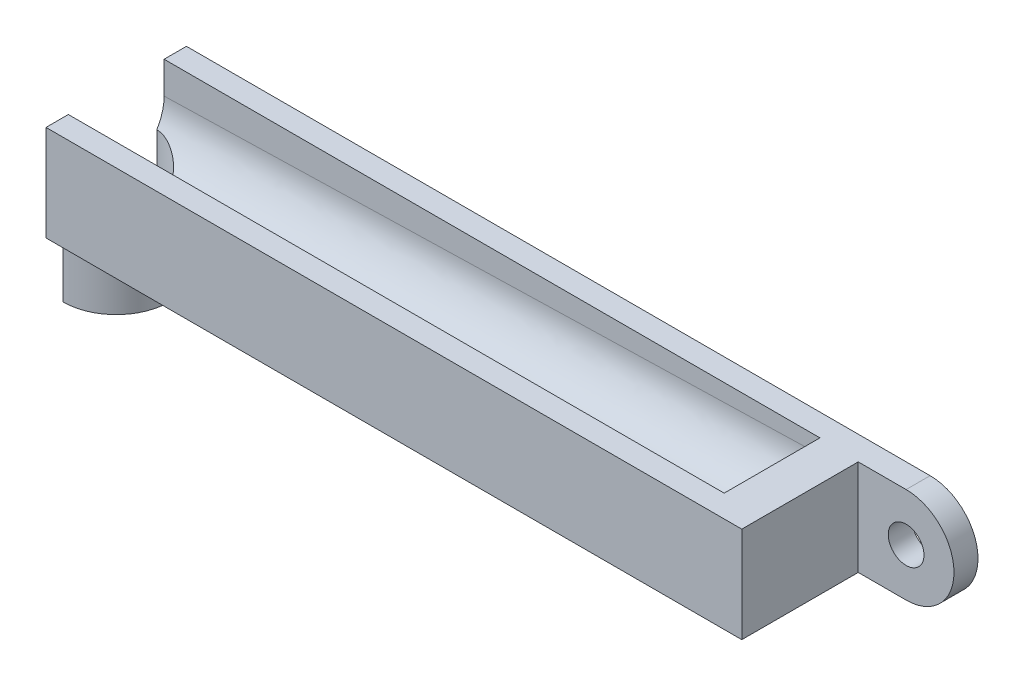
ISO-10303-21;
HEADER;
FILE_DESCRIPTION(('STEP AP214'),'2;1');
FILE_NAME('part.step','',(''),(''),'','','');
FILE_SCHEMA(('AUTOMOTIVE_DESIGN { 1 0 10303 214 1 1 1 1 }'));
ENDSEC;
DATA;
#1=APPLICATION_CONTEXT('core data for automotive mechanical design processes');
#2=APPLICATION_PROTOCOL_DEFINITION('international standard','automotive_design',2000,#1);
#3=PRODUCT_CONTEXT('',#1,'mechanical');
#4=PRODUCT('Part','Part','',(#3));
#5=PRODUCT_RELATED_PRODUCT_CATEGORY('part','',(#4));
#6=PRODUCT_DEFINITION_FORMATION('','',#4);
#7=PRODUCT_DEFINITION_CONTEXT('part definition',#1,'design');
#8=PRODUCT_DEFINITION('design','',#6,#7);
#9=PRODUCT_DEFINITION_SHAPE('','',#8);
#10=(LENGTH_UNIT() NAMED_UNIT(*) SI_UNIT(.MILLI.,.METRE.));
#11=(NAMED_UNIT(*) PLANE_ANGLE_UNIT() SI_UNIT($,.RADIAN.));
#12=(NAMED_UNIT(*) SI_UNIT($,.STERADIAN.) SOLID_ANGLE_UNIT());
#13=UNCERTAINTY_MEASURE_WITH_UNIT(LENGTH_MEASURE(1.E-05),#10,'distance_accuracy_value','');
#14=(GEOMETRIC_REPRESENTATION_CONTEXT(3) GLOBAL_UNCERTAINTY_ASSIGNED_CONTEXT((#13)) GLOBAL_UNIT_ASSIGNED_CONTEXT((#10,
#11,#12)) REPRESENTATION_CONTEXT('',''));
#15=CARTESIAN_POINT('',(0.,0.,0.));
#16=DIRECTION('',(0.,0.,1.));
#17=DIRECTION('',(1.,0.,0.));
#18=AXIS2_PLACEMENT_3D('',#15,#16,#17);
#19=CARTESIAN_POINT('',(138.4173,-22.225,0.));
#20=DIRECTION('',(0.,-1.,0.));
#21=DIRECTION('',(0.,0.,-1.));
#22=AXIS2_PLACEMENT_3D('',#19,#20,#21);
#23=PLANE('',#22);
#24=CARTESIAN_POINT('',(138.4173,-22.225,0.));
#25=DIRECTION('',(0.,1.,0.));
#26=DIRECTION('',(0.,0.,-1.));
#27=AXIS2_PLACEMENT_3D('',#24,#25,#26);
#28=CIRCLE('',#27,10.6045);
#29=CARTESIAN_POINT('',(138.4173,-22.225,10.6045));
#30=VERTEX_POINT('',#29);
#31=CARTESIAN_POINT('',(138.4173,-22.225,-10.6045));
#32=VERTEX_POINT('',#31);
#33=EDGE_CURVE('E157',#30,#32,#28,.T.);
#34=ORIENTED_EDGE('',*,*,#33,.F.);
#35=DIRECTION('',(0.,0.,-1.));
#36=VECTOR('',#35,1.);
#37=CARTESIAN_POINT('',(138.4173,-22.225,13.97));
#38=LINE('',#37,#36);
#39=CARTESIAN_POINT('',(138.4173,-22.225,8.0645));
#40=VERTEX_POINT('',#39);
#41=EDGE_CURVE('E150',#30,#40,#38,.T.);
#42=ORIENTED_EDGE('',*,*,#41,.T.);
#43=CARTESIAN_POINT('',(138.4173,-22.225,0.));
#44=DIRECTION('',(0.,1.,0.));
#45=DIRECTION('',(0.,0.,-1.));
#46=AXIS2_PLACEMENT_3D('',#43,#44,#45);
#47=CIRCLE('',#46,8.0645);
#48=CARTESIAN_POINT('',(138.4173,-22.225,-8.0645));
#49=VERTEX_POINT('',#48);
#50=EDGE_CURVE('E238',#40,#49,#47,.T.);
#51=ORIENTED_EDGE('',*,*,#50,.T.);
#52=EDGE_CURVE('E243',#49,#32,#38,.T.);
#53=ORIENTED_EDGE('',*,*,#52,.T.);
#54=EDGE_LOOP('',(#34,#42,#51,#53));
#55=FACE_BOUND('',#54,.T.);
#56=ADVANCED_FACE('F32',(#55),#23,.T.);
#57=CARTESIAN_POINT('',(138.4173,-22.225,0.));
#58=DIRECTION('',(0.,1.,0.));
#59=DIRECTION('',(0.,0.,1.));
#60=AXIS2_PLACEMENT_3D('',#57,#58,#59);
#61=CYLINDRICAL_SURFACE('',#60,10.6045);
#62=DIRECTION('',(0.,1.,0.));
#63=VECTOR('',#62,1.);
#64=CARTESIAN_POINT('',(138.4173,-22.225,-10.6045));
#65=LINE('',#64,#63);
#66=CARTESIAN_POINT('',(138.4173,-9.525,-10.6045));
#67=VERTEX_POINT('',#66);
#68=EDGE_CURVE('E154',#32,#67,#65,.T.);
#69=ORIENTED_EDGE('',*,*,#68,.T.);
#70=CARTESIAN_POINT('',(138.4173,-9.525,0.));
#71=DIRECTION('',(0.,-1.,0.));
#72=DIRECTION('',(0.,0.,1.));
#73=AXIS2_PLACEMENT_3D('',#70,#71,#72);
#74=CIRCLE('',#73,10.6045);
#75=CARTESIAN_POINT('',(138.4173,-9.525,10.6045));
#76=VERTEX_POINT('',#75);
#77=EDGE_CURVE('E11',#76,#67,#74,.F.);
#78=ORIENTED_EDGE('',*,*,#77,.F.);
#79=DIRECTION('',(0.,1.,0.));
#80=VECTOR('',#79,1.);
#81=CARTESIAN_POINT('',(138.4173,-22.225,10.6045));
#82=LINE('',#81,#80);
#83=EDGE_CURVE('E147',#76,#30,#82,.F.);
#84=ORIENTED_EDGE('',*,*,#83,.T.);
#85=ORIENTED_EDGE('',*,*,#33,.T.);
#86=EDGE_LOOP('',(#69,#78,#84,#85));
#87=FACE_BOUND('',#86,.T.);
#88=ADVANCED_FACE('F156',(#87),#61,.T.);
#89=CARTESIAN_POINT('',(138.4173,-22.225,0.));
#90=DIRECTION('',(0.,1.,0.));
#91=DIRECTION('',(0.,0.,1.));
#92=AXIS2_PLACEMENT_3D('',#89,#90,#91);
#93=CYLINDRICAL_SURFACE('',#92,8.0645);
#94=ORIENTED_EDGE('',*,*,#50,.F.);
#95=DIRECTION('',(0.,-1.,0.));
#96=VECTOR('',#95,1.);
#97=CARTESIAN_POINT('',(138.4173,9.52500000000009,8.0645));
#98=LINE('',#97,#96);
#99=CARTESIAN_POINT('',(138.4173,-1.89347755741299,8.0645));
#100=VERTEX_POINT('',#99);
#101=EDGE_CURVE('E49',#40,#100,#98,.F.);
#102=ORIENTED_EDGE('',*,*,#101,.T.);
#103=CARTESIAN_POINT('',(138.4173,-1.893477557413,-8.0645));
#104=CARTESIAN_POINT('',(138.486338509512,-1.89166509618479,-8.06450122168329));
#105=CARTESIAN_POINT('',(138.555403404494,-1.89127251769599,-8.06361317446126));
#106=CARTESIAN_POINT('',(138.693437975759,-1.89329565352478,-8.06006646387264));
#107=CARTESIAN_POINT('',(138.762407663026,-1.89571101096955,-8.05740802553111));
#108=CARTESIAN_POINT('',(138.968686940344,-1.90710555009781,-8.0468036435229));
#109=CARTESIAN_POINT('',(139.105660051718,-1.92022582089757,-8.03622855618554));
#110=CARTESIAN_POINT('',(139.375422222993,-1.95645794545555,-8.00851328840444));
#111=CARTESIAN_POINT('',(139.50824323286,-1.97941541652285,-7.99147499555421));
#112=CARTESIAN_POINT('',(139.771134234315,-2.03416363113123,-7.95116293380551));
#113=CARTESIAN_POINT('',(139.901202714301,-2.06595909935292,-7.92788582995689));
#114=CARTESIAN_POINT('',(140.208577106584,-2.15108622448129,-7.86516632289012));
#115=CARTESIAN_POINT('',(140.384336906244,-2.2079694724281,-7.82296691720035));
#116=CARTESIAN_POINT('',(140.728907134092,-2.33292870638938,-7.72816957525117));
#117=CARTESIAN_POINT('',(140.897714626759,-2.40100936098795,-7.67556729981786));
#118=CARTESIAN_POINT('',(141.229692270013,-2.54593743104196,-7.56027327808437));
#119=CARTESIAN_POINT('',(141.392806259584,-2.62285086131409,-7.49750389598407));
#120=CARTESIAN_POINT('',(141.71217389357,-2.78249733398254,-7.36274420877662));
#121=CARTESIAN_POINT('',(141.868427683975,-2.86523025243832,-7.2907541000211));
#122=CARTESIAN_POINT('',(142.250276716404,-3.07650217578338,-7.0999959261609));
#123=CARTESIAN_POINT('',(142.471833101411,-3.20741106738572,-6.97573420703643));
#124=CARTESIAN_POINT('',(142.900939814298,-3.47262194048076,-6.70798766444702));
#125=CARTESIAN_POINT('',(143.108483607304,-3.60692546550414,-6.56449396386022));
#126=CARTESIAN_POINT('',(143.509109937362,-3.87465214318861,-6.25883160393269));
#127=CARTESIAN_POINT('',(143.702220638198,-4.00807652117544,-6.09670096938882));
#128=CARTESIAN_POINT('',(144.073799542614,-4.27092552604783,-5.75361402433204));
#129=CARTESIAN_POINT('',(144.25227310029,-4.40035160456888,-5.57266465292213));
#130=CARTESIAN_POINT('',(144.560631984511,-4.62793211377197,-5.22859780206963));
#131=CARTESIAN_POINT('',(144.693260364503,-4.72731340914288,-5.0687442755236));
#132=CARTESIAN_POINT('',(144.947349771941,-4.91988610027664,-4.73690437159381));
#133=CARTESIAN_POINT('',(145.068812966343,-5.01307869617194,-4.56492036001078));
#134=CARTESIAN_POINT('',(145.299385121463,-5.19158642366717,-4.20926700130387));
#135=CARTESIAN_POINT('',(145.408506876956,-5.27690969639455,-4.02561007032792));
#136=CARTESIAN_POINT('',(145.613266658151,-5.43814973997114,-3.64698714927302));
#137=CARTESIAN_POINT('',(145.708907241836,-5.51406829498509,-3.4520233145569));
#138=CARTESIAN_POINT('',(145.869737398579,-5.64243125130164,-3.08703460838471));
#139=CARTESIAN_POINT('',(145.937321724702,-5.69665337438041,-2.91868726705674));
#140=CARTESIAN_POINT('',(146.061616799493,-5.79673201350475,-2.57562598660811));
#141=CARTESIAN_POINT('',(146.118329773629,-5.84259024162485,-2.40091335925491));
#142=CARTESIAN_POINT('',(146.220108829459,-5.92511149714523,-2.04606646711942));
#143=CARTESIAN_POINT('',(146.265179190755,-5.96177790313741,-1.86593422174664));
#144=CARTESIAN_POINT('',(146.343017305039,-6.02522141376103,-1.50130419983232));
#145=CARTESIAN_POINT('',(146.375784912666,-6.05199840154719,-1.31680637173804));
#146=CARTESIAN_POINT('',(146.428590266043,-6.09519772885091,-0.943928558818516));
#147=CARTESIAN_POINT('',(146.448569910743,-6.11157280564796,-0.755534814275804));
#148=CARTESIAN_POINT('',(146.475207012586,-6.13341220472642,-0.377172972319024));
#149=CARTESIAN_POINT('',(146.481864441128,-6.13887650358291,-0.187204871525768));
#150=CARTESIAN_POINT('',(146.481734618926,-6.13876999621962,0.192711301271527));
#151=CARTESIAN_POINT('',(146.474948170089,-6.13319984818903,0.382659373794362));
#152=CARTESIAN_POINT('',(146.448056619786,-6.11115210426788,0.760963080205654));
#153=CARTESIAN_POINT('',(146.42795205187,-6.09467494533483,0.949318777581825));
#154=CARTESIAN_POINT('',(146.376707312273,-6.05275364057798,1.30944831815795));
#155=CARTESIAN_POINT('',(146.346468530875,-6.02804265568402,1.48143764186625));
#156=CARTESIAN_POINT('',(146.275264423629,-5.96999125695433,1.82175385735741));
#157=CARTESIAN_POINT('',(146.234295451981,-5.93664791014314,1.99007948323005));
#158=CARTESIAN_POINT('',(146.142195872749,-5.86191819984588,2.32202615685273));
#159=CARTESIAN_POINT('',(146.091068553168,-5.82053443893766,2.48564870730684));
#160=CARTESIAN_POINT('',(145.979238112784,-5.73035745355051,2.80754346738453));
#161=CARTESIAN_POINT('',(145.918531427493,-5.68156147123286,2.96581365866535));
#162=CARTESIAN_POINT('',(145.78322611336,-5.57330025208726,3.28817954802761));
#163=CARTESIAN_POINT('',(145.707921726124,-5.51330557056704,3.45180141516908));
#164=CARTESIAN_POINT('',(145.547758199398,-5.38647011030597,3.7715700142372));
#165=CARTESIAN_POINT('',(145.462895267663,-5.31962661533156,3.92771374403385));
#166=CARTESIAN_POINT('',(145.195024634888,-5.11013483865318,4.38441817598845));
#167=CARTESIAN_POINT('',(144.998727973784,-4.95851950575256,4.6732688246686));
#168=CARTESIAN_POINT('',(144.632624391694,-4.68162613209482,5.14488364737323));
#169=CARTESIAN_POINT('',(144.469713010873,-4.56010676458918,5.33539669109072));
#170=CARTESIAN_POINT('',(144.129073011201,-4.31096889517377,5.69857667349938));
#171=CARTESIAN_POINT('',(143.951337809269,-4.1833476943639,5.87123560633565));
#172=CARTESIAN_POINT('',(143.581802648776,-3.92477198644624,6.19880471589004));
#173=CARTESIAN_POINT('',(143.389978665142,-3.79381204632815,6.3536833634987));
#174=CARTESIAN_POINT('',(142.993006617669,-3.5320126679356,6.64527734464367));
#175=CARTESIAN_POINT('',(142.78786317241,-3.4011732036779,6.78199892466878));
#176=CARTESIAN_POINT('',(142.41834220829,-3.17646562337186,7.00440307457374));
#177=CARTESIAN_POINT('',(142.256966194809,-3.08170440901505,7.09419342111636));
#178=CARTESIAN_POINT('',(141.926465086751,-2.89637005243713,7.26335928802849));
#179=CARTESIAN_POINT('',(141.757339288777,-2.80579729187899,7.34273386049143));
#180=CARTESIAN_POINT('',(141.411395944579,-2.63154330594256,7.49045096194537));
#181=CARTESIAN_POINT('',(141.234595532114,-2.54784782564135,7.55881660749617));
#182=CARTESIAN_POINT('',(140.872703773941,-2.39033290404474,7.6839942574546));
#183=CARTESIAN_POINT('',(140.687617017829,-2.31650808380714,7.74081256334983));
#184=CARTESIAN_POINT('',(140.372356568279,-2.20502345304227,7.82501973818367));
#185=CARTESIAN_POINT('',(140.244472560642,-2.16351690158071,7.85590170918726));
#186=CARTESIAN_POINT('',(139.985259732557,-2.08798451641423,7.91171439852365));
#187=CARTESIAN_POINT('',(139.853932229538,-2.05395586719925,7.93664735702748));
#188=CARTESIAN_POINT('',(139.588653781635,-1.99481662107535,7.98010639963252));
#189=CARTESIAN_POINT('',(139.454712107265,-1.96967902030761,7.99865187918271));
#190=CARTESIAN_POINT('',(139.184628640744,-1.9294182406905,8.02906011789665));
#191=CARTESIAN_POINT('',(139.048488346073,-1.91428851763418,8.0409272433141));
#192=CARTESIAN_POINT('',(138.829647861291,-1.89876764558756,8.05437190776033));
#193=CARTESIAN_POINT('',(138.747313422749,-1.89490376525848,8.05816595054862));
#194=CARTESIAN_POINT('',(138.582406316548,-1.89117055488649,8.06323279365226));
#195=CARTESIAN_POINT('',(138.499833504952,-1.891304661052,8.06450342413288));
#196=CARTESIAN_POINT('',(138.4173,-1.89347755741299,8.0645));
#197=B_SPLINE_CURVE_WITH_KNOTS('',3,(#103,#104,#105,#106,#107,#108,#109,#110,#111,#112,#113,
#114,#115,#116,#117,#118,#119,#120,#121,#122,#123,#124,#125,#126,#127,#128,#129,#130,#131,#132,
#133,#134,#135,#136,#137,#138,#139,#140,#141,#142,#143,#144,#145,#146,#147,#148,#149,#150,#151,
#152,#153,#154,#155,#156,#157,#158,#159,#160,#161,#162,#163,#164,#165,#166,#167,#168,#169,#170,
#171,#172,#173,#174,#175,#176,#177,#178,#179,#180,#181,#182,#183,#184,#185,#186,#187,#188,#189,
#190,#191,#192,#193,#194,#195,#196),.UNSPECIFIED.,.F.,.F.,(4,2,2,2,2,2,2,2,2,2,2,2,2,2,2,2,2,2,
2,2,2,2,2,2,2,2,2,2,2,2,2,2,2,2,2,2,2,2,2,2,2,2,2,2,2,2,4),(0.,0.207145597104745,
0.414264870049337,0.827626898952442,1.23472654039575,1.6420442320615,2.20959669323147,
2.77738638921491,3.34973600096062,3.92207342677992,4.77823197408041,5.63478707792631,
6.48962458160509,7.34414798798741,8.03431936533694,8.72435650922381,9.41367158114747,
10.1028556825049,10.6703094014833,11.2376468329997,11.804775424375,12.371910716264,
12.9416047843827,13.5113000756056,14.0809613863306,14.6505998766212,15.1791179142763,
15.7078157601312,16.2363427575979,16.7650668860718,17.3340435941868,17.9032468379116,
19.0415966815331,19.8763778740696,20.7115317773137,21.5481444703431,22.3844685977917,
23.0067809436093,23.6291498848802,24.2501944361116,24.8708991622745,25.2844411517819,
25.6978271705231,26.1099466499332,26.5217963750138,26.769208586411,27.0168334509553),.UNSPECIFIED.);
#198=CARTESIAN_POINT('',(138.4173,-1.893477557413,-8.0645));
#199=VERTEX_POINT('',#198);
#200=EDGE_CURVE('E161',#199,#100,#197,.T.);
#201=ORIENTED_EDGE('',*,*,#200,.F.);
#202=DIRECTION('',(0.,-1.,0.));
#203=VECTOR('',#202,1.);
#204=CARTESIAN_POINT('',(138.4173,9.52500000000009,-8.0645));
#205=LINE('',#204,#203);
#206=EDGE_CURVE('E241',#199,#49,#205,.T.);
#207=ORIENTED_EDGE('',*,*,#206,.T.);
#208=EDGE_LOOP('',(#94,#102,#201,#207));
#209=FACE_BOUND('',#208,.T.);
#210=ADVANCED_FACE('F225',(#209),#93,.F.);
#211=CARTESIAN_POINT('',(138.4173,0.,0.));
#212=DIRECTION('',(1.,0.,0.));
#213=DIRECTION('',(0.,0.,1.));
#214=AXIS2_PLACEMENT_3D('',#211,#212,#213);
#215=PLANE('',#214);
#216=CARTESIAN_POINT('',(138.4173,-6.985,-11.43));
#217=DIRECTION('',(1.,0.,0.));
#218=DIRECTION('',(0.,0.,-1.));
#219=AXIS2_PLACEMENT_3D('',#216,#217,#218);
#220=CIRCLE('',#219,1.397);
#221=CARTESIAN_POINT('',(138.4173,-6.985,-12.827));
#222=VERTEX_POINT('',#221);
#223=EDGE_CURVE('E36',#222,#222,#220,.T.);
#224=ORIENTED_EDGE('',*,*,#223,.T.);
#225=EDGE_LOOP('',(#224));
#226=FACE_BOUND('',#225,.T.);
#227=CARTESIAN_POINT('',(138.4173,3.17500000000009,-9.525));
#228=CARTESIAN_POINT('',(138.4173,2.90710636951569,-9.52502880308579));
#229=CARTESIAN_POINT('',(138.4173,2.63921688214058,-9.5136993193376));
#230=CARTESIAN_POINT('',(138.4173,2.10535446999233,-9.46853181588204));
#231=CARTESIAN_POINT('',(138.4173,1.83938145406681,-9.43469487392717));
#232=CARTESIAN_POINT('',(138.4173,1.31141986681751,-9.34475207723556));
#233=CARTESIAN_POINT('',(138.4173,1.04942862616524,-9.28866189247582));
#234=CARTESIAN_POINT('',(138.4173,0.531103084706367,-9.15462068517997));
#235=CARTESIAN_POINT('',(138.4173,0.274768715199605,-9.07666992828848));
#236=CARTESIAN_POINT('',(138.4173,-0.230541539428631,-8.89941777473788));
#237=CARTESIAN_POINT('',(138.4173,-0.479513981745249,-8.80010656301914));
#238=CARTESIAN_POINT('',(138.4173,-0.96821199674888,-8.58085916286381));
#239=CARTESIAN_POINT('',(138.4173,-1.20793737117213,-8.46092253250404));
#240=CARTESIAN_POINT('',(138.4173,-1.67638284749587,-8.2013051127429));
#241=CARTESIAN_POINT('',(138.4173,-1.90510519690559,-8.06162837866167));
#242=CARTESIAN_POINT('',(138.4173,-2.34997044894806,-7.7635057612349));
#243=CARTESIAN_POINT('',(138.4173,-2.56611340884636,-7.6050599633423));
#244=CARTESIAN_POINT('',(138.4173,-2.98429198445746,-7.27051906656807));
#245=CARTESIAN_POINT('',(138.4173,-3.18632710630337,-7.09442335034852));
#246=CARTESIAN_POINT('',(138.4173,-3.57484139426011,-6.72584294773196));
#247=CARTESIAN_POINT('',(138.4173,-3.76132089085019,-6.53335860968686));
#248=CARTESIAN_POINT('',(138.4173,-4.11743232508971,-6.13333322053391));
#249=CARTESIAN_POINT('',(138.4173,-4.2870615046551,-5.9257897141086));
#250=CARTESIAN_POINT('',(138.4173,-4.60823143453897,-5.49714962732861));
#251=CARTESIAN_POINT('',(138.4173,-4.75977219291506,-5.27605305301128));
#252=CARTESIAN_POINT('',(138.4173,-5.04368159450875,-4.82188885302562));
#253=CARTESIAN_POINT('',(138.4173,-5.17605108156057,-4.58882175485864));
#254=CARTESIAN_POINT('',(138.4173,-5.42068476516995,-4.11236460914558));
#255=CARTESIAN_POINT('',(138.4173,-5.53294896060468,-3.86897456102298));
#256=CARTESIAN_POINT('',(138.4173,-5.7365673365378,-3.37361789299633));
#257=CARTESIAN_POINT('',(138.4173,-5.82792285664935,-3.12165182374448));
#258=CARTESIAN_POINT('',(138.4173,-5.98908364968768,-2.61091955380518));
#259=CARTESIAN_POINT('',(138.4173,-6.05888892412982,-2.3521533535959));
#260=CARTESIAN_POINT('',(138.4173,-6.17645419778953,-1.82965499214984));
#261=CARTESIAN_POINT('',(138.4173,-6.22421374425433,-1.56592272904088));
#262=CARTESIAN_POINT('',(138.4173,-6.29734591601616,-1.03537233089459));
#263=CARTESIAN_POINT('',(138.4173,-6.322718540079,-0.76855419568715));
#264=CARTESIAN_POINT('',(138.4173,-6.3508968068655,-0.233722777773008));
#265=CARTESIAN_POINT('',(138.4173,-6.35370193022794,0.0342905322970395));
#266=CARTESIAN_POINT('',(138.4173,-6.33672388793071,0.569600735391586));
#267=CARTESIAN_POINT('',(138.4173,-6.31694072225219,0.836897628415487));
#268=CARTESIAN_POINT('',(138.4173,-6.25492706052983,1.36887199031537));
#269=CARTESIAN_POINT('',(138.4173,-6.21269678737656,1.63354948517432));
#270=CARTESIAN_POINT('',(138.4173,-6.10608928151298,2.15840604120375));
#271=CARTESIAN_POINT('',(138.4173,-6.04171204891415,2.41858510239688));
#272=CARTESIAN_POINT('',(138.4173,-5.89126854645122,2.93259425821957));
#273=CARTESIAN_POINT('',(138.4173,-5.80520234490116,3.18642437284373));
#274=CARTESIAN_POINT('',(138.4173,-5.61199268640835,3.68593189843645));
#275=CARTESIAN_POINT('',(138.4173,-5.50484923055732,3.93160930982728));
#276=CARTESIAN_POINT('',(138.4173,-5.27024493227508,4.41306862968216));
#277=CARTESIAN_POINT('',(138.4173,-5.14278376923979,4.64885038192307));
#278=CARTESIAN_POINT('',(138.4173,-4.86844857714667,5.10884279359658));
#279=CARTESIAN_POINT('',(138.4173,-4.72157414041553,5.33305320989682));
#280=CARTESIAN_POINT('',(138.4173,-4.40946793786088,5.76829068041108));
#281=CARTESIAN_POINT('',(138.4173,-4.24423725362736,5.97931851022827));
#282=CARTESIAN_POINT('',(138.4173,-3.89658647370972,6.38670460568251));
#283=CARTESIAN_POINT('',(138.4173,-3.71416641049008,6.58306289902373));
#284=CARTESIAN_POINT('',(138.4173,-3.33345892458108,6.95968923569139));
#285=CARTESIAN_POINT('',(138.4173,-3.13517362651337,7.13995942666822));
#286=CARTESIAN_POINT('',(138.4173,-2.72412365795625,7.48315788187575));
#287=CARTESIAN_POINT('',(138.4173,-2.51135898460188,7.64608614267509));
#288=CARTESIAN_POINT('',(138.4173,-2.07278924351203,7.95349406108793));
#289=CARTESIAN_POINT('',(138.4173,-1.8469798491703,8.09796754610229));
#290=CARTESIAN_POINT('',(138.4173,-1.38399811433214,8.36737063028996));
#291=CARTESIAN_POINT('',(138.4173,-1.14682612033463,8.49230082493489));
#292=CARTESIAN_POINT('',(138.4173,-0.662645561547024,8.72180739776883));
#293=CARTESIAN_POINT('',(138.4173,-0.415630821013257,8.82637074679174));
#294=CARTESIAN_POINT('',(138.4173,0.0863298593561501,9.01429736468387));
#295=CARTESIAN_POINT('',(138.4173,0.341275584258725,9.09766120750801));
#296=CARTESIAN_POINT('',(138.4173,0.856950944211646,9.24250591805611));
#297=CARTESIAN_POINT('',(138.4173,1.11767278306814,9.30401457551381));
#298=CARTESIAN_POINT('',(138.4173,1.64326629049545,9.40483738558105));
#299=CARTESIAN_POINT('',(138.4173,1.90813585620842,9.44416243310338));
#300=CARTESIAN_POINT('',(138.4173,2.34048489351578,9.48984743799971));
#301=CARTESIAN_POINT('',(138.4173,2.50727229378025,9.50303805093001));
#302=CARTESIAN_POINT('',(138.4173,2.84103400798305,9.52060801901113));
#303=CARTESIAN_POINT('',(138.4173,3.00800755710718,9.52500190448859));
#304=CARTESIAN_POINT('',(138.4173,3.17500000000009,9.525));
#305=B_SPLINE_CURVE_WITH_KNOTS('',3,(#227,#228,#229,#230,#231,#232,#233,#234,#235,#236,#237,
#238,#239,#240,#241,#242,#243,#244,#245,#246,#247,#248,#249,#250,#251,#252,#253,#254,#255,#256,
#257,#258,#259,#260,#261,#262,#263,#264,#265,#266,#267,#268,#269,#270,#271,#272,#273,#274,#275,
#276,#277,#278,#279,#280,#281,#282,#283,#284,#285,#286,#287,#288,#289,#290,#291,#292,#293,#294,
#295,#296,#297,#298,#299,#300,#301,#302,#303,#304),.UNSPECIFIED.,.F.,.F.,(4,2,2,2,2,2,2,2,2,2,2,
2,2,2,2,2,2,2,2,2,2,2,2,2,2,2,2,2,2,2,2,2,2,2,2,2,2,2,4),(0.,0.803435583558495,1.60683269798474,
2.40966508872313,3.21248772404982,4.01568004487274,4.81888957715372,5.62193434081105,
6.42497544845702,7.22804465373076,8.03109679345123,8.83428016205537,9.63746317287526,
10.4406108203955,11.2437585127696,12.0468547332747,12.8499508973074,13.6530635537795,
14.4561762545271,15.2593074377996,16.062438621742,16.8655618310701,17.6686850363557,
18.4718057120653,19.2749263461771,20.0780596544184,20.881209830915,21.684312709132,
22.4874140706102,23.2904080627445,24.0934022137632,24.8966642441936,25.6999017949724,
26.5036515207281,27.307379483466,28.1100817859002,28.9123895176335,29.414100884836,
29.9149828453434),.UNSPECIFIED.);
#306=CARTESIAN_POINT('',(138.4173,3.17500000000009,-9.525));
#307=VERTEX_POINT('',#306);
#308=EDGE_CURVE('E197',#307,#199,#305,.T.);
#309=ORIENTED_EDGE('',*,*,#308,.F.);
#310=DIRECTION('',(0.,-1.,0.));
#311=VECTOR('',#310,1.);
#312=CARTESIAN_POINT('',(138.4173,9.49083598752051,-9.525));
#313=LINE('',#312,#311);
#314=CARTESIAN_POINT('',(138.4173,9.52500000000009,-9.525));
#315=VERTEX_POINT('',#314);
#316=EDGE_CURVE('E292',#315,#307,#313,.T.);
#317=ORIENTED_EDGE('',*,*,#316,.F.);
#318=DIRECTION('',(0.,0.,1.));
#319=VECTOR('',#318,1.);
#320=CARTESIAN_POINT('',(138.4173,9.525,13.97));
#321=LINE('',#320,#319);
#322=CARTESIAN_POINT('',(138.4173,9.525,-13.97));
#323=VERTEX_POINT('',#322);
#324=EDGE_CURVE('E281',#323,#315,#321,.T.);
#325=ORIENTED_EDGE('',*,*,#324,.F.);
#326=DIRECTION('',(0.,1.,0.));
#327=VECTOR('',#326,1.);
#328=CARTESIAN_POINT('',(138.4173,-9.525,-13.97));
#329=LINE('',#328,#327);
#330=CARTESIAN_POINT('',(138.4173,-9.525,-13.97));
#331=VERTEX_POINT('',#330);
#332=EDGE_CURVE('E271',#331,#323,#329,.T.);
#333=ORIENTED_EDGE('',*,*,#332,.F.);
#334=DIRECTION('',(0.,0.,-1.));
#335=VECTOR('',#334,1.);
#336=CARTESIAN_POINT('',(138.4173,-9.525,13.97));
#337=LINE('',#336,#335);
#338=EDGE_CURVE('E145',#67,#331,#337,.T.);
#339=ORIENTED_EDGE('',*,*,#338,.F.);
#340=ORIENTED_EDGE('',*,*,#68,.F.);
#341=ORIENTED_EDGE('',*,*,#52,.F.);
#342=ORIENTED_EDGE('',*,*,#206,.F.);
#343=EDGE_LOOP('',(#309,#317,#325,#333,#339,#340,#341,#342));
#344=FACE_BOUND('',#343,.T.);
#345=ADVANCED_FACE('F229',(#226,#344),#215,.F.);
#346=CARTESIAN_POINT('',(276.8346,0.,0.));
#347=DIRECTION('',(1.,0.,0.));
#348=DIRECTION('',(0.,0.,1.));
#349=AXIS2_PLACEMENT_3D('',#346,#347,#348);
#350=PLANE('',#349);
#351=DIRECTION('',(0.,0.,1.));
#352=VECTOR('',#351,1.);
#353=CARTESIAN_POINT('',(276.8346,9.525,13.97));
#354=LINE('',#353,#352);
#355=CARTESIAN_POINT('',(276.8346,9.525,-9.1948));
#356=VERTEX_POINT('',#355);
#357=CARTESIAN_POINT('',(276.8346,9.525,13.97));
#358=VERTEX_POINT('',#357);
#359=EDGE_CURVE('E275',#356,#358,#354,.T.);
#360=ORIENTED_EDGE('',*,*,#359,.T.);
#361=DIRECTION('',(0.,-1.,0.));
#362=VECTOR('',#361,1.);
#363=CARTESIAN_POINT('',(276.8346,-9.525,13.97));
#364=LINE('',#363,#362);
#365=CARTESIAN_POINT('',(276.8346,-9.525,13.97));
#366=VERTEX_POINT('',#365);
#367=EDGE_CURVE('E272',#358,#366,#364,.T.);
#368=ORIENTED_EDGE('',*,*,#367,.T.);
#369=DIRECTION('',(0.,0.,-1.));
#370=VECTOR('',#369,1.);
#371=CARTESIAN_POINT('',(276.8346,-9.525,13.97));
#372=LINE('',#371,#370);
#373=CARTESIAN_POINT('',(276.8346,-9.525,-9.1948));
#374=VERTEX_POINT('',#373);
#375=EDGE_CURVE('E268',#366,#374,#372,.T.);
#376=ORIENTED_EDGE('',*,*,#375,.T.);
#377=DIRECTION('',(0.,-1.,0.));
#378=VECTOR('',#377,1.);
#379=CARTESIAN_POINT('',(276.8346,-9.525,-9.1948));
#380=LINE('',#379,#378);
#381=EDGE_CURVE('E335',#356,#374,#380,.T.);
#382=ORIENTED_EDGE('',*,*,#381,.F.);
#383=EDGE_LOOP('',(#360,#368,#376,#382));
#384=FACE_BOUND('',#383,.T.);
#385=ADVANCED_FACE('F234',(#384),#350,.T.);
#386=CARTESIAN_POINT('',(138.4173,9.525,13.97));
#387=DIRECTION('',(0.,-1.,0.));
#388=DIRECTION('',(0.,0.,-1.));
#389=AXIS2_PLACEMENT_3D('',#386,#387,#388);
#390=PLANE('',#389);
#391=DIRECTION('',(1.,0.,0.));
#392=VECTOR('',#391,1.);
#393=CARTESIAN_POINT('',(138.4173,9.525,-9.525));
#394=LINE('',#393,#392);
#395=CARTESIAN_POINT('',(268.8844,9.525,-9.525));
#396=VERTEX_POINT('',#395);
#397=EDGE_CURVE('E277',#315,#396,#394,.T.);
#398=ORIENTED_EDGE('',*,*,#397,.T.);
#399=DIRECTION('',(0.,0.,1.));
#400=VECTOR('',#399,1.);
#401=CARTESIAN_POINT('',(268.8844,9.525,13.97));
#402=LINE('',#401,#400);
#403=CARTESIAN_POINT('',(268.8844,9.525,9.525));
#404=VERTEX_POINT('',#403);
#405=EDGE_CURVE('E41',#396,#404,#402,.T.);
#406=ORIENTED_EDGE('',*,*,#405,.T.);
#407=DIRECTION('',(-1.,0.,0.));
#408=VECTOR('',#407,1.);
#409=CARTESIAN_POINT('',(138.4173,9.525,9.525));
#410=LINE('',#409,#408);
#411=CARTESIAN_POINT('',(138.4173,9.525,9.525));
#412=VERTEX_POINT('',#411);
#413=EDGE_CURVE('E289',#404,#412,#410,.T.);
#414=ORIENTED_EDGE('',*,*,#413,.T.);
#415=CARTESIAN_POINT('',(138.4173,9.525,13.97));
#416=VERTEX_POINT('',#415);
#417=EDGE_CURVE('E284',#412,#416,#321,.T.);
#418=ORIENTED_EDGE('',*,*,#417,.T.);
#419=DIRECTION('',(1.,0.,0.));
#420=VECTOR('',#419,1.);
#421=CARTESIAN_POINT('',(138.4173,9.525,13.97));
#422=LINE('',#421,#420);
#423=EDGE_CURVE('E263',#416,#358,#422,.T.);
#424=ORIENTED_EDGE('',*,*,#423,.T.);
#425=ORIENTED_EDGE('',*,*,#359,.F.);
#426=DIRECTION('',(-1.,0.,0.));
#427=VECTOR('',#426,1.);
#428=CARTESIAN_POINT('',(276.8346,9.525,-9.1948));
#429=LINE('',#428,#427);
#430=CARTESIAN_POINT('',(286.3596,9.525,-9.1948));
#431=VERTEX_POINT('',#430);
#432=EDGE_CURVE('E333',#431,#356,#429,.T.);
#433=ORIENTED_EDGE('',*,*,#432,.F.);
#434=DIRECTION('',(0.,0.,-1.));
#435=VECTOR('',#434,1.);
#436=CARTESIAN_POINT('',(286.3596,9.525,-9.1948));
#437=LINE('',#436,#435);
#438=CARTESIAN_POINT('',(286.3596,9.525,-13.97));
#439=VERTEX_POINT('',#438);
#440=EDGE_CURVE('E304',#431,#439,#437,.T.);
#441=ORIENTED_EDGE('',*,*,#440,.T.);
#442=DIRECTION('',(1.,0.,0.));
#443=VECTOR('',#442,1.);
#444=CARTESIAN_POINT('',(138.4173,9.525,-13.97));
#445=LINE('',#444,#443);
#446=EDGE_CURVE('E260',#323,#439,#445,.T.);
#447=ORIENTED_EDGE('',*,*,#446,.F.);
#448=ORIENTED_EDGE('',*,*,#324,.T.);
#449=EDGE_LOOP('',(#398,#406,#414,#418,#424,#425,#433,#441,#447,#448));
#450=FACE_BOUND('',#449,.T.);
#451=ADVANCED_FACE('F319',(#450),#390,.F.);
#452=CARTESIAN_POINT('',(138.4173,-6.985,11.43));
#453=DIRECTION('',(1.,0.,0.));
#454=DIRECTION('',(0.,0.,-1.));
#455=AXIS2_PLACEMENT_3D('',#452,#453,#454);
#456=CIRCLE('',#455,1.397);
#457=CARTESIAN_POINT('',(138.4173,-6.985,10.033));
#458=VERTEX_POINT('',#457);
#459=EDGE_CURVE('E250',#458,#458,#456,.T.);
#460=ORIENTED_EDGE('',*,*,#459,.T.);
#461=EDGE_LOOP('',(#460));
#462=FACE_BOUND('',#461,.T.);
#463=CARTESIAN_POINT('',(138.4173,-9.525,13.97));
#464=VERTEX_POINT('',#463);
#465=EDGE_CURVE('E136',#464,#76,#337,.T.);
#466=ORIENTED_EDGE('',*,*,#465,.F.);
#467=DIRECTION('',(0.,-1.,0.));
#468=VECTOR('',#467,1.);
#469=CARTESIAN_POINT('',(138.4173,-9.525,13.97));
#470=LINE('',#469,#468);
#471=EDGE_CURVE('E279',#416,#464,#470,.T.);
#472=ORIENTED_EDGE('',*,*,#471,.F.);
#473=ORIENTED_EDGE('',*,*,#417,.F.);
#474=DIRECTION('',(0.,1.,0.));
#475=VECTOR('',#474,1.);
#476=CARTESIAN_POINT('',(138.4173,3.1408359875205,9.525));
#477=LINE('',#476,#475);
#478=CARTESIAN_POINT('',(138.4173,3.17500000000009,9.525));
#479=VERTEX_POINT('',#478);
#480=EDGE_CURVE('E204',#479,#412,#477,.T.);
#481=ORIENTED_EDGE('',*,*,#480,.F.);
#482=EDGE_CURVE('E205',#100,#479,#305,.T.);
#483=ORIENTED_EDGE('',*,*,#482,.F.);
#484=ORIENTED_EDGE('',*,*,#101,.F.);
#485=ORIENTED_EDGE('',*,*,#41,.F.);
#486=ORIENTED_EDGE('',*,*,#83,.F.);
#487=EDGE_LOOP('',(#466,#472,#473,#481,#483,#484,#485,#486));
#488=FACE_BOUND('',#487,.T.);
#489=ADVANCED_FACE('F148',(#462,#488),#215,.F.);
#490=CARTESIAN_POINT('',(138.4173,-9.525,-13.97));
#491=DIRECTION('',(0.,0.,1.));
#492=DIRECTION('',(-1.,0.,0.));
#493=AXIS2_PLACEMENT_3D('',#490,#491,#492);
#494=PLANE('',#493);
#495=DIRECTION('',(1.,0.,0.));
#496=VECTOR('',#495,1.);
#497=CARTESIAN_POINT('',(138.4173,-9.525,-13.97));
#498=LINE('',#497,#496);
#499=CARTESIAN_POINT('',(286.3596,-9.525,-13.97));
#500=VERTEX_POINT('',#499);
#501=EDGE_CURVE('E144',#331,#500,#498,.T.);
#502=ORIENTED_EDGE('',*,*,#501,.F.);
#503=ORIENTED_EDGE('',*,*,#332,.T.);
#504=ORIENTED_EDGE('',*,*,#446,.T.);
#505=CARTESIAN_POINT('',(286.3596,0.,-13.97));
#506=DIRECTION('',(0.,0.,1.));
#507=DIRECTION('',(1.,0.,0.));
#508=AXIS2_PLACEMENT_3D('',#505,#506,#507);
#509=CIRCLE('',#508,9.525);
#510=EDGE_CURVE('E330',#500,#439,#509,.T.);
#511=ORIENTED_EDGE('',*,*,#510,.F.);
#512=EDGE_LOOP('',(#502,#503,#504,#511));
#513=FACE_BOUND('',#512,.T.);
#514=CARTESIAN_POINT('',(286.3596,0.,-13.97));
#515=DIRECTION('',(0.,0.,1.));
#516=DIRECTION('',(1.,0.,0.));
#517=AXIS2_PLACEMENT_3D('',#514,#515,#516);
#518=CIRCLE('',#517,3.556);
#519=CARTESIAN_POINT('',(289.9156,0.,-13.97));
#520=VERTEX_POINT('',#519);
#521=EDGE_CURVE('E326',#520,#520,#518,.T.);
#522=ORIENTED_EDGE('',*,*,#521,.T.);
#523=EDGE_LOOP('',(#522));
#524=FACE_BOUND('',#523,.T.);
#525=ADVANCED_FACE('F34',(#513,#524),#494,.F.);
#526=CARTESIAN_POINT('',(138.4173,-9.525,13.97));
#527=DIRECTION('',(0.,0.,-1.));
#528=DIRECTION('',(1.,0.,0.));
#529=AXIS2_PLACEMENT_3D('',#526,#527,#528);
#530=PLANE('',#529);
#531=ORIENTED_EDGE('',*,*,#367,.F.);
#532=ORIENTED_EDGE('',*,*,#423,.F.);
#533=ORIENTED_EDGE('',*,*,#471,.T.);
#534=DIRECTION('',(1.,0.,0.));
#535=VECTOR('',#534,1.);
#536=CARTESIAN_POINT('',(138.4173,-9.525,13.97));
#537=LINE('',#536,#535);
#538=EDGE_CURVE('E142',#464,#366,#537,.T.);
#539=ORIENTED_EDGE('',*,*,#538,.T.);
#540=EDGE_LOOP('',(#531,#532,#533,#539));
#541=FACE_BOUND('',#540,.T.);
#542=ADVANCED_FACE('F348',(#541),#530,.F.);
#543=CARTESIAN_POINT('',(138.4173,-9.525,13.97));
#544=DIRECTION('',(0.,1.,0.));
#545=DIRECTION('',(0.,0.,1.));
#546=AXIS2_PLACEMENT_3D('',#543,#544,#545);
#547=PLANE('',#546);
#548=ORIENTED_EDGE('',*,*,#77,.T.);
#549=ORIENTED_EDGE('',*,*,#338,.T.);
#550=ORIENTED_EDGE('',*,*,#501,.T.);
#551=DIRECTION('',(0.,0.,-1.));
#552=VECTOR('',#551,1.);
#553=CARTESIAN_POINT('',(286.3596,-9.525,-9.1948));
#554=LINE('',#553,#552);
#555=CARTESIAN_POINT('',(286.3596,-9.525,-9.1948));
#556=VERTEX_POINT('',#555);
#557=EDGE_CURVE('E206',#556,#500,#554,.T.);
#558=ORIENTED_EDGE('',*,*,#557,.F.);
#559=DIRECTION('',(1.,0.,0.));
#560=VECTOR('',#559,1.);
#561=CARTESIAN_POINT('',(286.3596,-9.525,-9.1948));
#562=LINE('',#561,#560);
#563=EDGE_CURVE('E57',#374,#556,#562,.T.);
#564=ORIENTED_EDGE('',*,*,#563,.F.);
#565=ORIENTED_EDGE('',*,*,#375,.F.);
#566=ORIENTED_EDGE('',*,*,#538,.F.);
#567=ORIENTED_EDGE('',*,*,#465,.T.);
#568=EDGE_LOOP('',(#548,#549,#550,#558,#564,#565,#566,#567));
#569=FACE_BOUND('',#568,.T.);
#570=ADVANCED_FACE('F138',(#569),#547,.F.);
#571=CARTESIAN_POINT('',(268.8844,6.59140124795832,0.));
#572=DIRECTION('',(-1.,0.,0.));
#573=DIRECTION('',(0.,0.,-1.));
#574=AXIS2_PLACEMENT_3D('',#571,#572,#573);
#575=PLANE('',#574);
#576=ORIENTED_EDGE('',*,*,#405,.F.);
#577=DIRECTION('',(0.,1.,0.));
#578=VECTOR('',#577,1.);
#579=CARTESIAN_POINT('',(268.8844,12.9414012479583,-9.525));
#580=LINE('',#579,#578);
#581=CARTESIAN_POINT('',(268.8844,6.59140124795838,-9.525));
#582=VERTEX_POINT('',#581);
#583=EDGE_CURVE('E295',#582,#396,#580,.T.);
#584=ORIENTED_EDGE('',*,*,#583,.F.);
#585=CARTESIAN_POINT('',(268.8844,6.59140124795832,0.));
#586=DIRECTION('',(1.,0.,0.));
#587=DIRECTION('',(0.,0.,-1.));
#588=AXIS2_PLACEMENT_3D('',#585,#586,#587);
#589=CIRCLE('',#588,9.525);
#590=CARTESIAN_POINT('',(268.8844,6.59140124795837,9.525));
#591=VERTEX_POINT('',#590);
#592=EDGE_CURVE('E297',#591,#582,#589,.T.);
#593=ORIENTED_EDGE('',*,*,#592,.F.);
#594=DIRECTION('',(0.,-1.,0.));
#595=VECTOR('',#594,1.);
#596=CARTESIAN_POINT('',(268.8844,6.59140124795832,9.525));
#597=LINE('',#596,#595);
#598=EDGE_CURVE('E300',#404,#591,#597,.T.);
#599=ORIENTED_EDGE('',*,*,#598,.F.);
#600=EDGE_LOOP('',(#576,#584,#593,#599));
#601=FACE_BOUND('',#600,.T.);
#602=ADVANCED_FACE('F313',(#601),#575,.T.);
#603=CARTESIAN_POINT('',(137.112629,9.49083598752051,-9.525));
#604=DIRECTION('',(0.,0.,1.));
#605=DIRECTION('',(0.,-1.,0.));
#606=AXIS2_PLACEMENT_3D('',#603,#604,#605);
#607=PLANE('',#606);
#608=ORIENTED_EDGE('',*,*,#397,.F.);
#609=ORIENTED_EDGE('',*,*,#316,.T.);
#610=DIRECTION('',(0.999657324975558,0.0261769483078661,0.));
#611=VECTOR('',#610,1.);
#612=CARTESIAN_POINT('',(137.112629,3.1408359875205,-9.525));
#613=LINE('',#612,#611);
#614=EDGE_CURVE('E298',#307,#582,#613,.T.);
#615=ORIENTED_EDGE('',*,*,#614,.T.);
#616=ORIENTED_EDGE('',*,*,#583,.T.);
#617=EDGE_LOOP('',(#608,#609,#615,#616));
#618=FACE_BOUND('',#617,.T.);
#619=ADVANCED_FACE('F188',(#618),#607,.T.);
#620=CARTESIAN_POINT('',(137.112629,3.1408359875205,9.525));
#621=DIRECTION('',(0.,0.,-1.));
#622=DIRECTION('',(1.,0.,0.));
#623=AXIS2_PLACEMENT_3D('',#620,#621,#622);
#624=PLANE('',#623);
#625=ORIENTED_EDGE('',*,*,#413,.F.);
#626=ORIENTED_EDGE('',*,*,#598,.T.);
#627=DIRECTION('',(0.999657324975558,0.0261769483078661,0.));
#628=VECTOR('',#627,1.);
#629=CARTESIAN_POINT('',(137.112629,3.1408359875205,9.525));
#630=LINE('',#629,#628);
#631=EDGE_CURVE('E301',#479,#591,#630,.T.);
#632=ORIENTED_EDGE('',*,*,#631,.F.);
#633=ORIENTED_EDGE('',*,*,#480,.T.);
#634=EDGE_LOOP('',(#625,#626,#632,#633));
#635=FACE_BOUND('',#634,.T.);
#636=ADVANCED_FACE('F185',(#635),#624,.T.);
#637=CARTESIAN_POINT('',(137.112629,3.1408359875205,9.525));
#638=CARTESIAN_POINT('',(268.8844,6.59140124795843,9.525));
#639=CARTESIAN_POINT('',(137.112629,-15.9091640124795,9.525));
#640=CARTESIAN_POINT('',(268.8844,-12.4585987520416,9.525));
#641=CARTESIAN_POINT('',(137.112629,-15.9091640124795,-9.525));
#642=CARTESIAN_POINT('',(268.8844,-12.4585987520416,-9.525));
#643=CARTESIAN_POINT('',(137.112629,3.1408359875205,-9.525));
#644=CARTESIAN_POINT('',(268.8844,6.59140124795843,-9.525));
#645=(BOUNDED_SURFACE() B_SPLINE_SURFACE(3,1,((#637,#638),(#639,#640),(#641,#642),(#643,#644)),
.UNSPECIFIED.,.F.,.F.,.F.) B_SPLINE_SURFACE_WITH_KNOTS((4,4),(2,2),(0.,1.),(0.,1.),
.UNSPECIFIED.) GEOMETRIC_REPRESENTATION_ITEM() RATIONAL_B_SPLINE_SURFACE(((1.,1.),
(0.333333333333333,0.333333333333333),(0.333333333333333,0.333333333333333),(1.,1.))) REPRESENTATION_ITEM('') SURFACE());
#646=ORIENTED_EDGE('',*,*,#200,.T.);
#647=ORIENTED_EDGE('',*,*,#482,.T.);
#648=ORIENTED_EDGE('',*,*,#631,.T.);
#649=ORIENTED_EDGE('',*,*,#592,.T.);
#650=ORIENTED_EDGE('',*,*,#614,.F.);
#651=ORIENTED_EDGE('',*,*,#308,.T.);
#652=EDGE_LOOP('',(#646,#647,#648,#649,#650,#651));
#653=FACE_BOUND('',#652,.T.);
#654=ADVANCED_FACE('F177',(#653),#645,.F.);
#655=CARTESIAN_POINT('',(286.3596,0.,-9.1948));
#656=DIRECTION('',(0.,0.,-1.));
#657=DIRECTION('',(1.,0.,0.));
#658=AXIS2_PLACEMENT_3D('',#655,#656,#657);
#659=CYLINDRICAL_SURFACE('',#658,9.525);
#660=ORIENTED_EDGE('',*,*,#510,.T.);
#661=ORIENTED_EDGE('',*,*,#440,.F.);
#662=CARTESIAN_POINT('',(286.3596,0.,-9.1948));
#663=DIRECTION('',(0.,0.,1.));
#664=DIRECTION('',(1.,0.,0.));
#665=AXIS2_PLACEMENT_3D('',#662,#663,#664);
#666=CIRCLE('',#665,9.525);
#667=EDGE_CURVE('E338',#556,#431,#666,.T.);
#668=ORIENTED_EDGE('',*,*,#667,.F.);
#669=ORIENTED_EDGE('',*,*,#557,.T.);
#670=EDGE_LOOP('',(#660,#661,#668,#669));
#671=FACE_BOUND('',#670,.T.);
#672=ADVANCED_FACE('F184',(#671),#659,.T.);
#673=CARTESIAN_POINT('',(286.3596,0.,-9.1948));
#674=DIRECTION('',(0.,0.,-1.));
#675=DIRECTION('',(1.,0.,0.));
#676=AXIS2_PLACEMENT_3D('',#673,#674,#675);
#677=PLANE('',#676);
#678=CARTESIAN_POINT('',(286.3596,0.,-9.1948));
#679=DIRECTION('',(0.,0.,1.));
#680=DIRECTION('',(1.,0.,0.));
#681=AXIS2_PLACEMENT_3D('',#678,#679,#680);
#682=CIRCLE('',#681,3.556);
#683=CARTESIAN_POINT('',(289.9156,0.,-9.1948));
#684=VERTEX_POINT('',#683);
#685=EDGE_CURVE('E327',#684,#684,#682,.T.);
#686=ORIENTED_EDGE('',*,*,#685,.F.);
#687=EDGE_LOOP('',(#686));
#688=FACE_BOUND('',#687,.T.);
#689=ORIENTED_EDGE('',*,*,#432,.T.);
#690=ORIENTED_EDGE('',*,*,#381,.T.);
#691=ORIENTED_EDGE('',*,*,#563,.T.);
#692=ORIENTED_EDGE('',*,*,#667,.T.);
#693=EDGE_LOOP('',(#689,#690,#691,#692));
#694=FACE_BOUND('',#693,.T.);
#695=ADVANCED_FACE('F213',(#688,#694),#677,.F.);
#696=CARTESIAN_POINT('',(286.3596,0.,-9.1948));
#697=DIRECTION('',(0.,0.,-1.));
#698=DIRECTION('',(1.,0.,0.));
#699=AXIS2_PLACEMENT_3D('',#696,#697,#698);
#700=CYLINDRICAL_SURFACE('',#699,3.556);
#701=ORIENTED_EDGE('',*,*,#685,.T.);
#702=EDGE_LOOP('',(#701));
#703=FACE_BOUND('',#702,.T.);
#704=ORIENTED_EDGE('',*,*,#521,.F.);
#705=EDGE_LOOP('',(#704));
#706=FACE_BOUND('',#705,.T.);
#707=ADVANCED_FACE('F217',(#703,#706),#700,.F.);
#708=CARTESIAN_POINT('',(144.7673,-6.985,11.43));
#709=DIRECTION('',(-1.,0.,0.));
#710=DIRECTION('',(0.,0.,1.));
#711=AXIS2_PLACEMENT_3D('',#708,#709,#710);
#712=CYLINDRICAL_SURFACE('',#711,1.397);
#713=CARTESIAN_POINT('',(144.7673,-6.985,11.43));
#714=DIRECTION('',(-1.,0.,0.));
#715=DIRECTION('',(0.,0.,1.));
#716=AXIS2_PLACEMENT_3D('',#713,#714,#715);
#717=CIRCLE('',#716,1.397);
#718=CARTESIAN_POINT('',(144.7673,-6.985,12.827));
#719=VERTEX_POINT('',#718);
#720=EDGE_CURVE('E248',#719,#719,#717,.T.);
#721=ORIENTED_EDGE('',*,*,#720,.F.);
#722=EDGE_LOOP('',(#721));
#723=FACE_BOUND('',#722,.T.);
#724=ORIENTED_EDGE('',*,*,#459,.F.);
#725=EDGE_LOOP('',(#724));
#726=FACE_BOUND('',#725,.T.);
#727=ADVANCED_FACE('F221',(#723,#726),#712,.F.);
#728=CARTESIAN_POINT('',(144.7673,-6.985,11.43));
#729=DIRECTION('',(-1.,0.,0.));
#730=DIRECTION('',(0.,0.,1.));
#731=AXIS2_PLACEMENT_3D('',#728,#729,#730);
#732=PLANE('',#731);
#733=ORIENTED_EDGE('',*,*,#720,.T.);
#734=EDGE_LOOP('',(#733));
#735=FACE_BOUND('',#734,.T.);
#736=ADVANCED_FACE('F399',(#735),#732,.T.);
#737=CARTESIAN_POINT('',(144.7673,-6.985,-11.43));
#738=DIRECTION('',(-1.,0.,0.));
#739=DIRECTION('',(0.,0.,1.));
#740=AXIS2_PLACEMENT_3D('',#737,#738,#739);
#741=CYLINDRICAL_SURFACE('',#740,1.397);
#742=CARTESIAN_POINT('',(144.7673,-6.985,-11.43));
#743=DIRECTION('',(-1.,0.,0.));
#744=DIRECTION('',(0.,0.,1.));
#745=AXIS2_PLACEMENT_3D('',#742,#743,#744);
#746=CIRCLE('',#745,1.397);
#747=CARTESIAN_POINT('',(144.7673,-6.985,-10.033));
#748=VERTEX_POINT('',#747);
#749=EDGE_CURVE('E245',#748,#748,#746,.T.);
#750=ORIENTED_EDGE('',*,*,#749,.F.);
#751=EDGE_LOOP('',(#750));
#752=FACE_BOUND('',#751,.T.);
#753=ORIENTED_EDGE('',*,*,#223,.F.);
#754=EDGE_LOOP('',(#753));
#755=FACE_BOUND('',#754,.T.);
#756=ADVANCED_FACE('F407',(#752,#755),#741,.F.);
#757=CARTESIAN_POINT('',(144.7673,-6.985,-11.43));
#758=DIRECTION('',(-1.,0.,0.));
#759=DIRECTION('',(0.,0.,1.));
#760=AXIS2_PLACEMENT_3D('',#757,#758,#759);
#761=PLANE('',#760);
#762=ORIENTED_EDGE('',*,*,#749,.T.);
#763=EDGE_LOOP('',(#762));
#764=FACE_BOUND('',#763,.T.);
#765=ADVANCED_FACE('F414',(#764),#761,.T.);
#766=CLOSED_SHELL('',(#56,#88,#210,#345,#385,#451,#489,#525,#542,#570,#602,#619,#636,#654,#672,
#695,#707,#727,#736,#756,#765));
#767=MANIFOLD_SOLID_BREP('B2',#766);
#768=ADVANCED_BREP_SHAPE_REPRESENTATION('',(#18,#767),#14);
#769=SHAPE_DEFINITION_REPRESENTATION(#9,#768);
ENDSEC;
END-ISO-10303-21;
